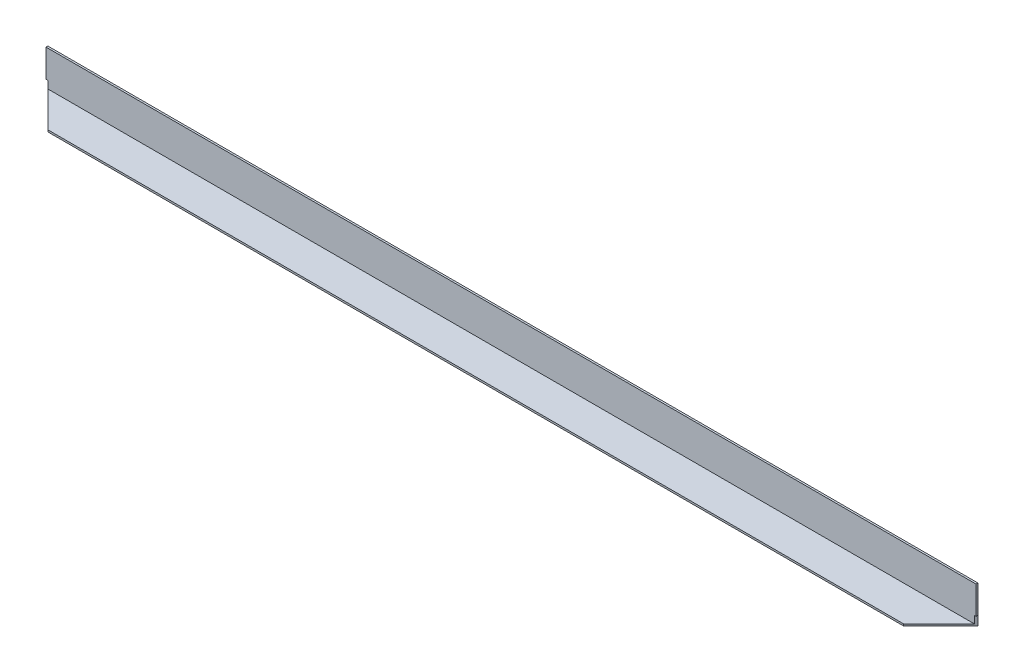
ISO-10303-21;
HEADER;
FILE_DESCRIPTION(('STEP AP214'),'2;1');
FILE_NAME('part.step','',(''),(''),'','','');
FILE_SCHEMA(('AUTOMOTIVE_DESIGN { 1 0 10303 214 1 1 1 1 }'));
ENDSEC;
DATA;
#1=APPLICATION_CONTEXT('core data for automotive mechanical design processes');
#2=APPLICATION_PROTOCOL_DEFINITION('international standard','automotive_design',2000,#1);
#3=PRODUCT_CONTEXT('',#1,'mechanical');
#4=PRODUCT('Part','Part','',(#3));
#5=PRODUCT_RELATED_PRODUCT_CATEGORY('part','',(#4));
#6=PRODUCT_DEFINITION_FORMATION('','',#4);
#7=PRODUCT_DEFINITION_CONTEXT('part definition',#1,'design');
#8=PRODUCT_DEFINITION('design','',#6,#7);
#9=PRODUCT_DEFINITION_SHAPE('','',#8);
#10=(LENGTH_UNIT() NAMED_UNIT(*) SI_UNIT(.MILLI.,.METRE.));
#11=(NAMED_UNIT(*) PLANE_ANGLE_UNIT() SI_UNIT($,.RADIAN.));
#12=(NAMED_UNIT(*) SI_UNIT($,.STERADIAN.) SOLID_ANGLE_UNIT());
#13=UNCERTAINTY_MEASURE_WITH_UNIT(LENGTH_MEASURE(1.E-05),#10,'distance_accuracy_value','');
#14=(GEOMETRIC_REPRESENTATION_CONTEXT(3) GLOBAL_UNCERTAINTY_ASSIGNED_CONTEXT((#13)) GLOBAL_UNIT_ASSIGNED_CONTEXT((#10,
#11,#12)) REPRESENTATION_CONTEXT('',''));
#15=CARTESIAN_POINT('',(0.,0.,0.));
#16=DIRECTION('',(0.,0.,1.));
#17=DIRECTION('',(1.,0.,0.));
#18=AXIS2_PLACEMENT_3D('',#15,#16,#17);
#19=CARTESIAN_POINT('',(-348.874598070739,66.7202572347267,40.));
#20=DIRECTION('',(1.,0.,0.));
#21=DIRECTION('',(0.,0.,-1.));
#22=AXIS2_PLACEMENT_3D('',#19,#20,#21);
#23=PLANE('',#22);
#24=DIRECTION('',(0.,-1.,0.));
#25=VECTOR('',#24,1.);
#26=CARTESIAN_POINT('',(-348.874598070739,66.7202572347267,0.));
#27=LINE('',#26,#25);
#28=CARTESIAN_POINT('',(-348.874598070739,66.7202572347267,0.));
#29=VERTEX_POINT('',#28);
#30=CARTESIAN_POINT('',(-348.874598070739,36.7202572347267,0.));
#31=VERTEX_POINT('',#30);
#32=EDGE_CURVE('E134',#29,#31,#27,.T.);
#33=ORIENTED_EDGE('',*,*,#32,.T.);
#34=DIRECTION('',(0.,0.,-1.));
#35=VECTOR('',#34,1.);
#36=CARTESIAN_POINT('',(-348.874598070739,36.7202572347267,40.));
#37=LINE('',#36,#35);
#38=CARTESIAN_POINT('',(-348.874598070739,36.7202572347267,2.));
#39=VERTEX_POINT('',#38);
#40=EDGE_CURVE('E164',#39,#31,#37,.T.);
#41=ORIENTED_EDGE('',*,*,#40,.F.);
#42=DIRECTION('',(0.,-1.,0.));
#43=VECTOR('',#42,1.);
#44=CARTESIAN_POINT('',(-348.874598070739,66.7202572347267,2.));
#45=LINE('',#44,#43);
#46=CARTESIAN_POINT('',(-348.874598070739,66.7202572347267,2.));
#47=VERTEX_POINT('',#46);
#48=EDGE_CURVE('E159',#47,#39,#45,.T.);
#49=ORIENTED_EDGE('',*,*,#48,.F.);
#50=DIRECTION('',(0.,0.,-1.));
#51=VECTOR('',#50,1.);
#52=CARTESIAN_POINT('',(-348.874598070739,66.7202572347267,40.));
#53=LINE('',#52,#51);
#54=EDGE_CURVE('E140',#47,#29,#53,.T.);
#55=ORIENTED_EDGE('',*,*,#54,.T.);
#56=EDGE_LOOP('',(#33,#41,#49,#55));
#57=FACE_BOUND('',#56,.T.);
#58=ADVANCED_FACE('F34',(#57),#23,.F.);
#59=CARTESIAN_POINT('',(-348.874598070739,26.7202572347267,40.));
#60=DIRECTION('',(0.,1.,0.));
#61=DIRECTION('',(0.,0.,1.));
#62=AXIS2_PLACEMENT_3D('',#59,#60,#61);
#63=PLANE('',#62);
#64=DIRECTION('',(1.,0.,0.));
#65=VECTOR('',#64,1.);
#66=CARTESIAN_POINT('',(-348.874598070739,26.7202572347267,0.));
#67=LINE('',#66,#65);
#68=CARTESIAN_POINT('',(-348.874598070739,26.7202572347267,0.));
#69=VERTEX_POINT('',#68);
#70=CARTESIAN_POINT('',(651.125401929261,26.7202572347267,0.));
#71=VERTEX_POINT('',#70);
#72=EDGE_CURVE('E133',#69,#71,#67,.T.);
#73=ORIENTED_EDGE('',*,*,#72,.T.);
#74=DIRECTION('',(0.707106781186548,0.,-0.707106781186547));
#75=VECTOR('',#74,1.);
#76=CARTESIAN_POINT('',(651.125401929261,26.7202572347267,0.));
#77=LINE('',#76,#75);
#78=CARTESIAN_POINT('',(611.12540192926,26.7202572347267,40.));
#79=VERTEX_POINT('',#78);
#80=EDGE_CURVE('E108',#79,#71,#77,.T.);
#81=ORIENTED_EDGE('',*,*,#80,.F.);
#82=DIRECTION('',(1.,0.,0.));
#83=VECTOR('',#82,1.);
#84=CARTESIAN_POINT('',(-348.874598070739,26.7202572347267,40.));
#85=LINE('',#84,#83);
#86=CARTESIAN_POINT('',(-308.874598070739,26.7202572347267,40.));
#87=VERTEX_POINT('',#86);
#88=EDGE_CURVE('E139',#87,#79,#85,.T.);
#89=ORIENTED_EDGE('',*,*,#88,.F.);
#90=DIRECTION('',(0.707106781186547,0.,0.707106781186548));
#91=VECTOR('',#90,1.);
#92=CARTESIAN_POINT('',(-348.874598070739,26.7202572347267,0.));
#93=LINE('',#92,#91);
#94=EDGE_CURVE('E170',#69,#87,#93,.T.);
#95=ORIENTED_EDGE('',*,*,#94,.F.);
#96=EDGE_LOOP('',(#73,#81,#89,#95));
#97=FACE_BOUND('',#96,.T.);
#98=ADVANCED_FACE('F196',(#97),#63,.F.);
#99=CARTESIAN_POINT('',(651.125401929261,66.7202572347267,40.));
#100=DIRECTION('',(-1.,0.,0.));
#101=DIRECTION('',(0.,0.,1.));
#102=AXIS2_PLACEMENT_3D('',#99,#100,#101);
#103=PLANE('',#102);
#104=DIRECTION('',(0.,-1.,0.));
#105=VECTOR('',#104,1.);
#106=CARTESIAN_POINT('',(651.125401929261,66.7202572347267,2.));
#107=LINE('',#106,#105);
#108=CARTESIAN_POINT('',(651.125401929261,66.7202572347267,2.));
#109=VERTEX_POINT('',#108);
#110=CARTESIAN_POINT('',(651.125401929261,36.7202572347267,2.));
#111=VERTEX_POINT('',#110);
#112=EDGE_CURVE('E126',#109,#111,#107,.T.);
#113=ORIENTED_EDGE('',*,*,#112,.T.);
#114=DIRECTION('',(0.,0.,1.));
#115=VECTOR('',#114,1.);
#116=CARTESIAN_POINT('',(651.125401929261,36.7202572347267,0.));
#117=LINE('',#116,#115);
#118=CARTESIAN_POINT('',(651.125401929261,36.7202572347267,0.));
#119=VERTEX_POINT('',#118);
#120=EDGE_CURVE('E107',#119,#111,#117,.T.);
#121=ORIENTED_EDGE('',*,*,#120,.F.);
#122=DIRECTION('',(0.,1.,0.));
#123=VECTOR('',#122,1.);
#124=CARTESIAN_POINT('',(651.125401929261,66.7202572347267,0.));
#125=LINE('',#124,#123);
#126=CARTESIAN_POINT('',(651.125401929261,66.7202572347267,0.));
#127=VERTEX_POINT('',#126);
#128=EDGE_CURVE('E119',#119,#127,#125,.T.);
#129=ORIENTED_EDGE('',*,*,#128,.T.);
#130=DIRECTION('',(0.,0.,-1.));
#131=VECTOR('',#130,1.);
#132=CARTESIAN_POINT('',(651.125401929261,66.7202572347267,40.));
#133=LINE('',#132,#131);
#134=EDGE_CURVE('E142',#109,#127,#133,.T.);
#135=ORIENTED_EDGE('',*,*,#134,.F.);
#136=EDGE_LOOP('',(#113,#121,#129,#135));
#137=FACE_BOUND('',#136,.T.);
#138=ADVANCED_FACE('F123',(#137),#103,.F.);
#139=CARTESIAN_POINT('',(-348.874598070739,66.7202572347267,40.));
#140=DIRECTION('',(0.,-1.,0.));
#141=DIRECTION('',(0.,0.,-1.));
#142=AXIS2_PLACEMENT_3D('',#139,#140,#141);
#143=PLANE('',#142);
#144=ORIENTED_EDGE('',*,*,#54,.F.);
#145=DIRECTION('',(-1.,0.,0.));
#146=VECTOR('',#145,1.);
#147=CARTESIAN_POINT('',(655.125401929261,66.7202572347267,2.));
#148=LINE('',#147,#146);
#149=EDGE_CURVE('E184',#109,#47,#148,.T.);
#150=ORIENTED_EDGE('',*,*,#149,.F.);
#151=ORIENTED_EDGE('',*,*,#134,.T.);
#152=DIRECTION('',(-1.,0.,0.));
#153=VECTOR('',#152,1.);
#154=CARTESIAN_POINT('',(-348.874598070739,66.7202572347267,0.));
#155=LINE('',#154,#153);
#156=EDGE_CURVE('E118',#127,#29,#155,.T.);
#157=ORIENTED_EDGE('',*,*,#156,.T.);
#158=EDGE_LOOP('',(#144,#150,#151,#157));
#159=FACE_BOUND('',#158,.T.);
#160=ADVANCED_FACE('F203',(#159),#143,.F.);
#161=CARTESIAN_POINT('',(0.,0.,40.));
#162=DIRECTION('',(0.,0.,1.));
#163=DIRECTION('',(1.,0.,0.));
#164=AXIS2_PLACEMENT_3D('',#161,#162,#163);
#165=PLANE('',#164);
#166=DIRECTION('',(0.,-1.,0.));
#167=VECTOR('',#166,1.);
#168=CARTESIAN_POINT('',(611.12540192926,36.7202572347267,40.));
#169=LINE('',#168,#167);
#170=CARTESIAN_POINT('',(611.12540192926,28.7202572347267,40.));
#171=VERTEX_POINT('',#170);
#172=EDGE_CURVE('E127',#171,#79,#169,.T.);
#173=ORIENTED_EDGE('',*,*,#172,.F.);
#174=DIRECTION('',(1.,0.,0.));
#175=VECTOR('',#174,1.);
#176=CARTESIAN_POINT('',(0.,28.7202572347267,40.));
#177=LINE('',#176,#175);
#178=CARTESIAN_POINT('',(-308.87459807074,28.7202572347267,40.));
#179=VERTEX_POINT('',#178);
#180=EDGE_CURVE('E144',#179,#171,#177,.T.);
#181=ORIENTED_EDGE('',*,*,#180,.F.);
#182=DIRECTION('',(0.,-1.,0.));
#183=VECTOR('',#182,1.);
#184=CARTESIAN_POINT('',(-308.874598070739,36.7202572347267,40.));
#185=LINE('',#184,#183);
#186=EDGE_CURVE('E48',#179,#87,#185,.T.);
#187=ORIENTED_EDGE('',*,*,#186,.T.);
#188=ORIENTED_EDGE('',*,*,#88,.T.);
#189=EDGE_LOOP('',(#173,#181,#187,#188));
#190=FACE_BOUND('',#189,.T.);
#191=ADVANCED_FACE('F192',(#190),#165,.T.);
#192=CARTESIAN_POINT('',(0.,0.,0.));
#193=DIRECTION('',(0.,0.,1.));
#194=DIRECTION('',(1.,0.,0.));
#195=AXIS2_PLACEMENT_3D('',#192,#193,#194);
#196=PLANE('',#195);
#197=ORIENTED_EDGE('',*,*,#32,.F.);
#198=ORIENTED_EDGE('',*,*,#156,.F.);
#199=ORIENTED_EDGE('',*,*,#128,.F.);
#200=EDGE_CURVE('E111',#71,#119,#125,.T.);
#201=ORIENTED_EDGE('',*,*,#200,.F.);
#202=ORIENTED_EDGE('',*,*,#72,.F.);
#203=DIRECTION('',(0.,-1.,0.));
#204=VECTOR('',#203,1.);
#205=CARTESIAN_POINT('',(-348.874598070739,36.7202572347267,0.));
#206=LINE('',#205,#204);
#207=EDGE_CURVE('E172',#31,#69,#206,.T.);
#208=ORIENTED_EDGE('',*,*,#207,.F.);
#209=EDGE_LOOP('',(#197,#198,#199,#201,#202,#208));
#210=FACE_BOUND('',#209,.T.);
#211=ADVANCED_FACE('F131',(#210),#196,.F.);
#212=CARTESIAN_POINT('',(655.125401929261,66.7202572347267,2.));
#213=DIRECTION('',(0.,0.,-1.));
#214=DIRECTION('',(0.,1.,0.));
#215=AXIS2_PLACEMENT_3D('',#212,#213,#214);
#216=PLANE('',#215);
#217=DIRECTION('',(-1.,0.,0.));
#218=VECTOR('',#217,1.);
#219=CARTESIAN_POINT('',(655.125401929261,28.7202572347267,2.));
#220=LINE('',#219,#218);
#221=CARTESIAN_POINT('',(649.125401929261,28.7202572347267,2.));
#222=VERTEX_POINT('',#221);
#223=CARTESIAN_POINT('',(-346.87459807074,28.7202572347267,2.));
#224=VERTEX_POINT('',#223);
#225=EDGE_CURVE('E183',#222,#224,#220,.T.);
#226=ORIENTED_EDGE('',*,*,#225,.F.);
#227=DIRECTION('',(0.,1.,0.));
#228=VECTOR('',#227,1.);
#229=CARTESIAN_POINT('',(649.125401929261,66.7202572347267,2.));
#230=LINE('',#229,#228);
#231=CARTESIAN_POINT('',(649.125401929261,36.7202572347267,2.));
#232=VERTEX_POINT('',#231);
#233=EDGE_CURVE('E56',#222,#232,#230,.T.);
#234=ORIENTED_EDGE('',*,*,#233,.T.);
#235=DIRECTION('',(1.,0.,0.));
#236=VECTOR('',#235,1.);
#237=CARTESIAN_POINT('',(655.125401929261,36.7202572347267,2.));
#238=LINE('',#237,#236);
#239=EDGE_CURVE('E11',#232,#111,#238,.T.);
#240=ORIENTED_EDGE('',*,*,#239,.T.);
#241=ORIENTED_EDGE('',*,*,#112,.F.);
#242=ORIENTED_EDGE('',*,*,#149,.T.);
#243=ORIENTED_EDGE('',*,*,#48,.T.);
#244=DIRECTION('',(1.,0.,0.));
#245=VECTOR('',#244,1.);
#246=CARTESIAN_POINT('',(655.125401929261,36.7202572347267,2.));
#247=LINE('',#246,#245);
#248=CARTESIAN_POINT('',(-346.874598070739,36.7202572347267,2.00000000000004));
#249=VERTEX_POINT('',#248);
#250=EDGE_CURVE('E41',#39,#249,#247,.T.);
#251=ORIENTED_EDGE('',*,*,#250,.T.);
#252=DIRECTION('',(0.,-1.,0.));
#253=VECTOR('',#252,1.);
#254=CARTESIAN_POINT('',(-346.87459807074,66.7202572347266,2.));
#255=LINE('',#254,#253);
#256=EDGE_CURVE('E156',#249,#224,#255,.T.);
#257=ORIENTED_EDGE('',*,*,#256,.T.);
#258=EDGE_LOOP('',(#226,#234,#240,#241,#242,#243,#251,#257));
#259=FACE_BOUND('',#258,.T.);
#260=ADVANCED_FACE('F155',(#259),#216,.F.);
#261=CARTESIAN_POINT('',(655.125401929261,28.7202572347267,2.));
#262=DIRECTION('',(0.,-1.,0.));
#263=DIRECTION('',(0.,0.,-1.));
#264=AXIS2_PLACEMENT_3D('',#261,#262,#263);
#265=PLANE('',#264);
#266=ORIENTED_EDGE('',*,*,#180,.T.);
#267=DIRECTION('',(0.707106781186548,0.,-0.707106781186547));
#268=VECTOR('',#267,1.);
#269=CARTESIAN_POINT('',(652.125401929261,28.7202572347267,-1.));
#270=LINE('',#269,#268);
#271=EDGE_CURVE('E149',#171,#222,#270,.T.);
#272=ORIENTED_EDGE('',*,*,#271,.T.);
#273=ORIENTED_EDGE('',*,*,#225,.T.);
#274=DIRECTION('',(0.707106781186547,0.,0.707106781186548));
#275=VECTOR('',#274,1.);
#276=CARTESIAN_POINT('',(154.12540192926,28.7202572347267,503.));
#277=LINE('',#276,#275);
#278=EDGE_CURVE('E147',#224,#179,#277,.T.);
#279=ORIENTED_EDGE('',*,*,#278,.T.);
#280=EDGE_LOOP('',(#266,#272,#273,#279));
#281=FACE_BOUND('',#280,.T.);
#282=ADVANCED_FACE('F200',(#281),#265,.F.);
#283=CARTESIAN_POINT('',(0.,36.7202572347267,0.));
#284=DIRECTION('',(0.,1.,0.));
#285=DIRECTION('',(0.,0.,1.));
#286=AXIS2_PLACEMENT_3D('',#283,#284,#285);
#287=PLANE('',#286);
#288=ORIENTED_EDGE('',*,*,#40,.T.);
#289=DIRECTION('',(0.707106781186547,0.,0.707106781186548));
#290=VECTOR('',#289,1.);
#291=CARTESIAN_POINT('',(-348.874598070739,36.7202572347267,0.));
#292=LINE('',#291,#290);
#293=EDGE_CURVE('E166',#31,#249,#292,.T.);
#294=ORIENTED_EDGE('',*,*,#293,.T.);
#295=ORIENTED_EDGE('',*,*,#250,.F.);
#296=EDGE_LOOP('',(#288,#294,#295));
#297=FACE_BOUND('',#296,.T.);
#298=ADVANCED_FACE('F163',(#297),#287,.F.);
#299=CARTESIAN_POINT('',(-348.874598070739,36.7202572347267,0.));
#300=DIRECTION('',(0.707106781186548,0.,-0.707106781186547));
#301=DIRECTION('',(-0.707106781186547,0.,-0.707106781186548));
#302=AXIS2_PLACEMENT_3D('',#299,#300,#301);
#303=PLANE('',#302);
#304=ORIENTED_EDGE('',*,*,#293,.F.);
#305=ORIENTED_EDGE('',*,*,#207,.T.);
#306=ORIENTED_EDGE('',*,*,#94,.T.);
#307=ORIENTED_EDGE('',*,*,#186,.F.);
#308=ORIENTED_EDGE('',*,*,#278,.F.);
#309=ORIENTED_EDGE('',*,*,#256,.F.);
#310=EDGE_LOOP('',(#304,#305,#306,#307,#308,#309));
#311=FACE_BOUND('',#310,.T.);
#312=ADVANCED_FACE('F198',(#311),#303,.F.);
#313=CARTESIAN_POINT('',(0.,36.7202572347267,0.));
#314=DIRECTION('',(0.,1.,0.));
#315=DIRECTION('',(0.,0.,1.));
#316=AXIS2_PLACEMENT_3D('',#313,#314,#315);
#317=PLANE('',#316);
#318=DIRECTION('',(0.707106781186548,0.,-0.707106781186547));
#319=VECTOR('',#318,1.);
#320=CARTESIAN_POINT('',(651.125401929261,36.7202572347267,0.));
#321=LINE('',#320,#319);
#322=EDGE_CURVE('E103',#232,#119,#321,.T.);
#323=ORIENTED_EDGE('',*,*,#322,.T.);
#324=ORIENTED_EDGE('',*,*,#120,.T.);
#325=ORIENTED_EDGE('',*,*,#239,.F.);
#326=EDGE_LOOP('',(#323,#324,#325));
#327=FACE_BOUND('',#326,.T.);
#328=ADVANCED_FACE('F105',(#327),#317,.F.);
#329=CARTESIAN_POINT('',(651.125401929261,36.7202572347267,0.));
#330=DIRECTION('',(-0.707106781186547,0.,-0.707106781186548));
#331=DIRECTION('',(-0.707106781186548,0.,0.707106781186547));
#332=AXIS2_PLACEMENT_3D('',#329,#330,#331);
#333=PLANE('',#332);
#334=ORIENTED_EDGE('',*,*,#271,.F.);
#335=ORIENTED_EDGE('',*,*,#172,.T.);
#336=ORIENTED_EDGE('',*,*,#80,.T.);
#337=ORIENTED_EDGE('',*,*,#200,.T.);
#338=ORIENTED_EDGE('',*,*,#322,.F.);
#339=ORIENTED_EDGE('',*,*,#233,.F.);
#340=EDGE_LOOP('',(#334,#335,#336,#337,#338,#339));
#341=FACE_BOUND('',#340,.T.);
#342=ADVANCED_FACE('F112',(#341),#333,.F.);
#343=CLOSED_SHELL('',(#58,#98,#138,#160,#191,#211,#260,#282,#298,#312,#328,#342));
#344=MANIFOLD_SOLID_BREP('B2',#343);
#345=ADVANCED_BREP_SHAPE_REPRESENTATION('',(#18,#344),#14);
#346=SHAPE_DEFINITION_REPRESENTATION(#9,#345);
ENDSEC;
END-ISO-10303-21;
